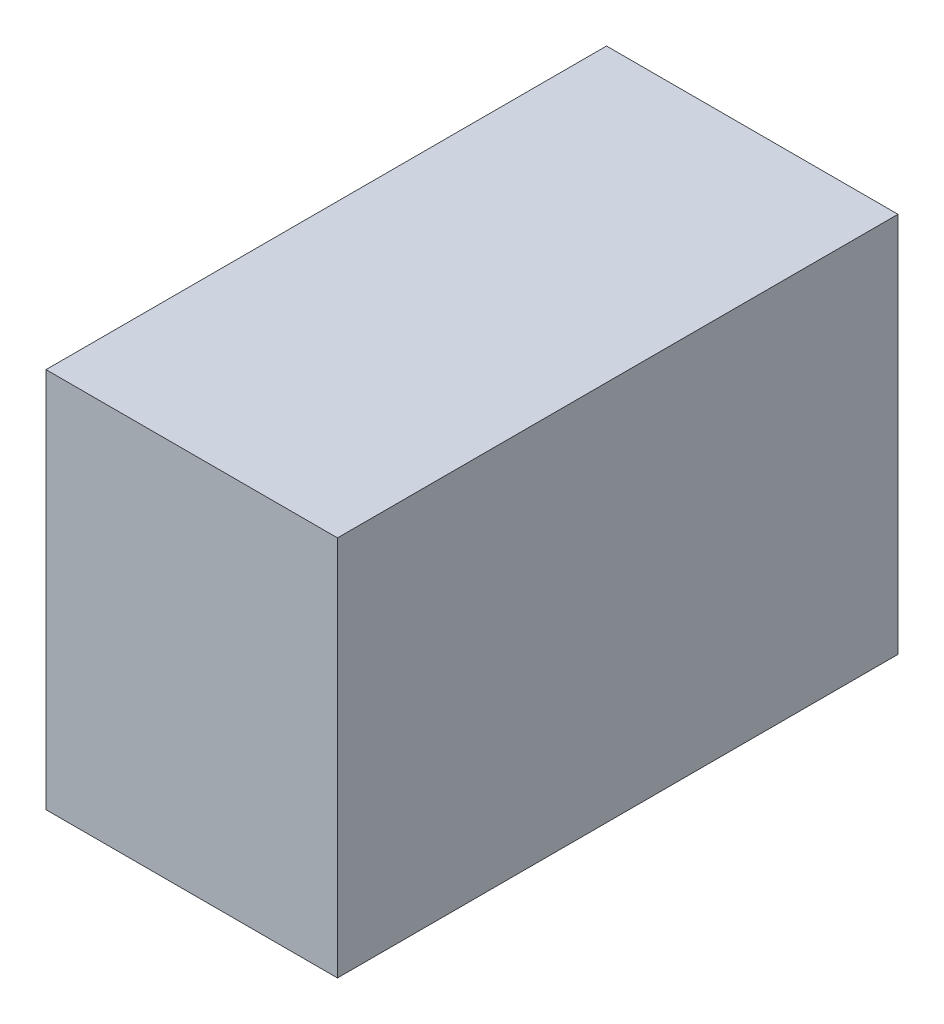
ISO-10303-21;
HEADER;
FILE_DESCRIPTION(('STEP AP214'),'2;1');
FILE_NAME('part.step','',(''),(''),'','','');
FILE_SCHEMA(('AUTOMOTIVE_DESIGN { 1 0 10303 214 1 1 1 1 }'));
ENDSEC;
DATA;
#1=APPLICATION_CONTEXT('core data for automotive mechanical design processes');
#2=APPLICATION_PROTOCOL_DEFINITION('international standard','automotive_design',2000,#1);
#3=PRODUCT_CONTEXT('',#1,'mechanical');
#4=PRODUCT('Part','Part','',(#3));
#5=PRODUCT_RELATED_PRODUCT_CATEGORY('part','',(#4));
#6=PRODUCT_DEFINITION_FORMATION('','',#4);
#7=PRODUCT_DEFINITION_CONTEXT('part definition',#1,'design');
#8=PRODUCT_DEFINITION('design','',#6,#7);
#9=PRODUCT_DEFINITION_SHAPE('','',#8);
#10=(LENGTH_UNIT() NAMED_UNIT(*) SI_UNIT(.MILLI.,.METRE.));
#11=(NAMED_UNIT(*) PLANE_ANGLE_UNIT() SI_UNIT($,.RADIAN.));
#12=(NAMED_UNIT(*) SI_UNIT($,.STERADIAN.) SOLID_ANGLE_UNIT());
#13=UNCERTAINTY_MEASURE_WITH_UNIT(LENGTH_MEASURE(1.E-05),#10,'distance_accuracy_value','');
#14=(GEOMETRIC_REPRESENTATION_CONTEXT(3) GLOBAL_UNCERTAINTY_ASSIGNED_CONTEXT((#13)) GLOBAL_UNIT_ASSIGNED_CONTEXT((#10,
#11,#12)) REPRESENTATION_CONTEXT('',''));
#15=CARTESIAN_POINT('',(0.,0.,0.));
#16=DIRECTION('',(0.,0.,1.));
#17=DIRECTION('',(1.,0.,0.));
#18=AXIS2_PLACEMENT_3D('',#15,#16,#17);
#19=CARTESIAN_POINT('',(65.,85.,250.));
#20=DIRECTION('',(-1.,0.,0.));
#21=DIRECTION('',(0.,-1.,0.));
#22=AXIS2_PLACEMENT_3D('',#19,#20,#21);
#23=PLANE('',#22);
#24=DIRECTION('',(0.,1.,0.));
#25=VECTOR('',#24,1.);
#26=CARTESIAN_POINT('',(65.,85.,0.));
#27=LINE('',#26,#25);
#28=CARTESIAN_POINT('',(65.,-85.,0.));
#29=VERTEX_POINT('',#28);
#30=CARTESIAN_POINT('',(65.,85.,0.));
#31=VERTEX_POINT('',#30);
#32=EDGE_CURVE('E107',#29,#31,#27,.T.);
#33=ORIENTED_EDGE('',*,*,#32,.T.);
#34=DIRECTION('',(0.,0.,-1.));
#35=VECTOR('',#34,1.);
#36=CARTESIAN_POINT('',(65.,85.,250.));
#37=LINE('',#36,#35);
#38=CARTESIAN_POINT('',(65.,85.,250.));
#39=VERTEX_POINT('',#38);
#40=EDGE_CURVE('E11',#39,#31,#37,.T.);
#41=ORIENTED_EDGE('',*,*,#40,.F.);
#42=DIRECTION('',(0.,1.,0.));
#43=VECTOR('',#42,1.);
#44=CARTESIAN_POINT('',(65.,85.,250.));
#45=LINE('',#44,#43);
#46=CARTESIAN_POINT('',(65.,-85.,250.));
#47=VERTEX_POINT('',#46);
#48=EDGE_CURVE('E91',#47,#39,#45,.T.);
#49=ORIENTED_EDGE('',*,*,#48,.F.);
#50=DIRECTION('',(0.,0.,-1.));
#51=VECTOR('',#50,1.);
#52=CARTESIAN_POINT('',(65.,-85.,250.));
#53=LINE('',#52,#51);
#54=EDGE_CURVE('E103',#47,#29,#53,.T.);
#55=ORIENTED_EDGE('',*,*,#54,.T.);
#56=EDGE_LOOP('',(#33,#41,#49,#55));
#57=FACE_BOUND('',#56,.T.);
#58=ADVANCED_FACE('F39',(#57),#23,.F.);
#59=CARTESIAN_POINT('',(-65.,85.,250.));
#60=DIRECTION('',(0.,-1.,0.));
#61=DIRECTION('',(0.,0.,-1.));
#62=AXIS2_PLACEMENT_3D('',#59,#60,#61);
#63=PLANE('',#62);
#64=DIRECTION('',(-1.,0.,0.));
#65=VECTOR('',#64,1.);
#66=CARTESIAN_POINT('',(-65.,85.,0.));
#67=LINE('',#66,#65);
#68=CARTESIAN_POINT('',(-65.,85.,0.));
#69=VERTEX_POINT('',#68);
#70=EDGE_CURVE('E96',#31,#69,#67,.T.);
#71=ORIENTED_EDGE('',*,*,#70,.T.);
#72=DIRECTION('',(0.,0.,-1.));
#73=VECTOR('',#72,1.);
#74=CARTESIAN_POINT('',(-65.,85.,250.));
#75=LINE('',#74,#73);
#76=CARTESIAN_POINT('',(-65.,85.,250.));
#77=VERTEX_POINT('',#76);
#78=EDGE_CURVE('E48',#77,#69,#75,.T.);
#79=ORIENTED_EDGE('',*,*,#78,.F.);
#80=DIRECTION('',(-1.,0.,0.));
#81=VECTOR('',#80,1.);
#82=CARTESIAN_POINT('',(-65.,85.,250.));
#83=LINE('',#82,#81);
#84=EDGE_CURVE('E86',#39,#77,#83,.T.);
#85=ORIENTED_EDGE('',*,*,#84,.F.);
#86=ORIENTED_EDGE('',*,*,#40,.T.);
#87=EDGE_LOOP('',(#71,#79,#85,#86));
#88=FACE_BOUND('',#87,.T.);
#89=ADVANCED_FACE('F95',(#88),#63,.F.);
#90=CARTESIAN_POINT('',(-65.,85.,250.));
#91=DIRECTION('',(1.,0.,0.));
#92=DIRECTION('',(0.,1.,0.));
#93=AXIS2_PLACEMENT_3D('',#90,#91,#92);
#94=PLANE('',#93);
#95=DIRECTION('',(0.,-1.,0.));
#96=VECTOR('',#95,1.);
#97=CARTESIAN_POINT('',(-65.,85.,0.));
#98=LINE('',#97,#96);
#99=CARTESIAN_POINT('',(-65.,-85.,0.));
#100=VERTEX_POINT('',#99);
#101=EDGE_CURVE('E73',#69,#100,#98,.T.);
#102=ORIENTED_EDGE('',*,*,#101,.T.);
#103=DIRECTION('',(0.,0.,-1.));
#104=VECTOR('',#103,1.);
#105=CARTESIAN_POINT('',(-65.,-85.,250.));
#106=LINE('',#105,#104);
#107=CARTESIAN_POINT('',(-65.,-85.,250.));
#108=VERTEX_POINT('',#107);
#109=EDGE_CURVE('E98',#108,#100,#106,.T.);
#110=ORIENTED_EDGE('',*,*,#109,.F.);
#111=DIRECTION('',(0.,-1.,0.));
#112=VECTOR('',#111,1.);
#113=CARTESIAN_POINT('',(-65.,85.,250.));
#114=LINE('',#113,#112);
#115=EDGE_CURVE('E89',#77,#108,#114,.T.);
#116=ORIENTED_EDGE('',*,*,#115,.F.);
#117=ORIENTED_EDGE('',*,*,#78,.T.);
#118=EDGE_LOOP('',(#102,#110,#116,#117));
#119=FACE_BOUND('',#118,.T.);
#120=ADVANCED_FACE('F99',(#119),#94,.F.);
#121=CARTESIAN_POINT('',(-65.,-85.,250.));
#122=DIRECTION('',(0.,1.,0.));
#123=DIRECTION('',(0.,0.,1.));
#124=AXIS2_PLACEMENT_3D('',#121,#122,#123);
#125=PLANE('',#124);
#126=DIRECTION('',(1.,0.,0.));
#127=VECTOR('',#126,1.);
#128=CARTESIAN_POINT('',(-65.,-85.,0.));
#129=LINE('',#128,#127);
#130=EDGE_CURVE('E79',#100,#29,#129,.T.);
#131=ORIENTED_EDGE('',*,*,#130,.T.);
#132=ORIENTED_EDGE('',*,*,#54,.F.);
#133=DIRECTION('',(1.,0.,0.));
#134=VECTOR('',#133,1.);
#135=CARTESIAN_POINT('',(-65.,-85.,250.));
#136=LINE('',#135,#134);
#137=EDGE_CURVE('E56',#108,#47,#136,.T.);
#138=ORIENTED_EDGE('',*,*,#137,.F.);
#139=ORIENTED_EDGE('',*,*,#109,.T.);
#140=EDGE_LOOP('',(#131,#132,#138,#139));
#141=FACE_BOUND('',#140,.T.);
#142=ADVANCED_FACE('F120',(#141),#125,.F.);
#143=CARTESIAN_POINT('',(0.,0.,250.));
#144=DIRECTION('',(0.,0.,1.));
#145=DIRECTION('',(1.,0.,0.));
#146=AXIS2_PLACEMENT_3D('',#143,#144,#145);
#147=PLANE('',#146);
#148=ORIENTED_EDGE('',*,*,#48,.T.);
#149=ORIENTED_EDGE('',*,*,#84,.T.);
#150=ORIENTED_EDGE('',*,*,#115,.T.);
#151=ORIENTED_EDGE('',*,*,#137,.T.);
#152=EDGE_LOOP('',(#148,#149,#150,#151));
#153=FACE_BOUND('',#152,.T.);
#154=ADVANCED_FACE('F87',(#153),#147,.T.);
#155=CARTESIAN_POINT('',(0.,0.,0.));
#156=DIRECTION('',(0.,0.,1.));
#157=DIRECTION('',(1.,0.,0.));
#158=AXIS2_PLACEMENT_3D('',#155,#156,#157);
#159=PLANE('',#158);
#160=ORIENTED_EDGE('',*,*,#32,.F.);
#161=ORIENTED_EDGE('',*,*,#130,.F.);
#162=ORIENTED_EDGE('',*,*,#101,.F.);
#163=ORIENTED_EDGE('',*,*,#70,.F.);
#164=EDGE_LOOP('',(#160,#161,#162,#163));
#165=FACE_BOUND('',#164,.T.);
#166=ADVANCED_FACE('F123',(#165),#159,.F.);
#167=CLOSED_SHELL('',(#58,#89,#120,#142,#154,#166));
#168=MANIFOLD_SOLID_BREP('B2',#167);
#169=ADVANCED_BREP_SHAPE_REPRESENTATION('',(#18,#168),#14);
#170=SHAPE_DEFINITION_REPRESENTATION(#9,#169);
ENDSEC;
END-ISO-10303-21;
